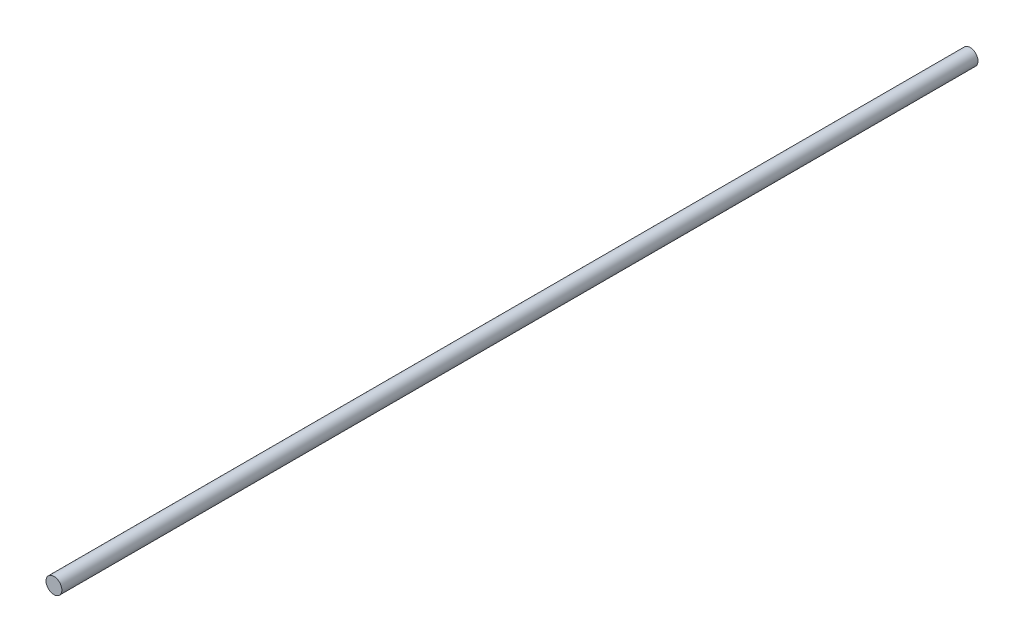
ISO-10303-21;
HEADER;
FILE_DESCRIPTION(('STEP AP214'),'2;1');
FILE_NAME('part.step','',(''),(''),'','','');
FILE_SCHEMA(('AUTOMOTIVE_DESIGN { 1 0 10303 214 1 1 1 1 }'));
ENDSEC;
DATA;
#1=APPLICATION_CONTEXT('core data for automotive mechanical design processes');
#2=APPLICATION_PROTOCOL_DEFINITION('international standard','automotive_design',2000,#1);
#3=PRODUCT_CONTEXT('',#1,'mechanical');
#4=PRODUCT('Part','Part','',(#3));
#5=PRODUCT_RELATED_PRODUCT_CATEGORY('part','',(#4));
#6=PRODUCT_DEFINITION_FORMATION('','',#4);
#7=PRODUCT_DEFINITION_CONTEXT('part definition',#1,'design');
#8=PRODUCT_DEFINITION('design','',#6,#7);
#9=PRODUCT_DEFINITION_SHAPE('','',#8);
#10=(LENGTH_UNIT() NAMED_UNIT(*) SI_UNIT(.MILLI.,.METRE.));
#11=(NAMED_UNIT(*) PLANE_ANGLE_UNIT() SI_UNIT($,.RADIAN.));
#12=(NAMED_UNIT(*) SI_UNIT($,.STERADIAN.) SOLID_ANGLE_UNIT());
#13=UNCERTAINTY_MEASURE_WITH_UNIT(LENGTH_MEASURE(1.E-05),#10,'distance_accuracy_value','');
#14=(GEOMETRIC_REPRESENTATION_CONTEXT(3) GLOBAL_UNCERTAINTY_ASSIGNED_CONTEXT((#13)) GLOBAL_UNIT_ASSIGNED_CONTEXT((#10,
#11,#12)) REPRESENTATION_CONTEXT('',''));
#15=CARTESIAN_POINT('',(0.,0.,0.));
#16=DIRECTION('',(0.,0.,1.));
#17=DIRECTION('',(1.,0.,0.));
#18=AXIS2_PLACEMENT_3D('',#15,#16,#17);
#19=CARTESIAN_POINT('',(0.,0.,231.25));
#20=DIRECTION('',(0.,0.,-1.));
#21=DIRECTION('',(-1.,0.,0.));
#22=AXIS2_PLACEMENT_3D('',#19,#20,#21);
#23=CYLINDRICAL_SURFACE('',#22,4.);
#24=CARTESIAN_POINT('',(0.,0.,231.25));
#25=DIRECTION('',(0.,0.,1.));
#26=DIRECTION('',(1.,0.,0.));
#27=AXIS2_PLACEMENT_3D('',#24,#25,#26);
#28=CIRCLE('',#27,4.);
#29=CARTESIAN_POINT('',(-4.,0.,231.25));
#30=VERTEX_POINT('',#29);
#31=EDGE_CURVE('E10',#30,#30,#28,.T.);
#32=CARTESIAN_POINT('',(0.,0.,-231.25));
#33=DIRECTION('',(0.,0.,1.));
#34=DIRECTION('',(1.,0.,0.));
#35=AXIS2_PLACEMENT_3D('',#32,#33,#34);
#36=CIRCLE('',#35,4.);
#37=CARTESIAN_POINT('',(-4.,0.,-231.25));
#38=VERTEX_POINT('',#37);
#39=EDGE_CURVE('E37',#38,#38,#36,.T.);
#40=CARTESIAN_POINT('',(-4.,0.,231.25));
#41=CARTESIAN_POINT('',(-4.,0.,226.432291666667));
#42=CARTESIAN_POINT('',(-4.,0.,221.614583333333));
#43=CARTESIAN_POINT('',(-4.,0.,211.979166666667));
#44=CARTESIAN_POINT('',(-4.,0.,207.161458333333));
#45=CARTESIAN_POINT('',(-4.,0.,197.526041666667));
#46=CARTESIAN_POINT('',(-4.,0.,192.708333333333));
#47=CARTESIAN_POINT('',(-4.,0.,183.072916666667));
#48=CARTESIAN_POINT('',(-4.,0.,178.255208333333));
#49=CARTESIAN_POINT('',(-4.,0.,168.619791666667));
#50=CARTESIAN_POINT('',(-4.,0.,163.802083333333));
#51=CARTESIAN_POINT('',(-4.,0.,154.166666666667));
#52=CARTESIAN_POINT('',(-4.,0.,149.348958333333));
#53=CARTESIAN_POINT('',(-4.,0.,139.713541666667));
#54=CARTESIAN_POINT('',(-4.,0.,134.895833333333));
#55=CARTESIAN_POINT('',(-4.,0.,125.260416666667));
#56=CARTESIAN_POINT('',(-4.,0.,120.442708333333));
#57=CARTESIAN_POINT('',(-4.,0.,110.807291666667));
#58=CARTESIAN_POINT('',(-4.,0.,105.989583333333));
#59=CARTESIAN_POINT('',(-4.,0.,96.3541666666667));
#60=CARTESIAN_POINT('',(-4.,0.,91.5364583333333));
#61=CARTESIAN_POINT('',(-4.,0.,81.9010416666667));
#62=CARTESIAN_POINT('',(-4.,0.,77.0833333333333));
#63=CARTESIAN_POINT('',(-4.,0.,67.4479166666667));
#64=CARTESIAN_POINT('',(-4.,0.,62.6302083333333));
#65=CARTESIAN_POINT('',(-4.,0.,52.9947916666667));
#66=CARTESIAN_POINT('',(-4.,0.,48.1770833333333));
#67=CARTESIAN_POINT('',(-4.,0.,38.5416666666667));
#68=CARTESIAN_POINT('',(-4.,0.,33.7239583333333));
#69=CARTESIAN_POINT('',(-4.,0.,24.0885416666667));
#70=CARTESIAN_POINT('',(-4.,0.,19.2708333333333));
#71=CARTESIAN_POINT('',(-4.,0.,9.63541666666665));
#72=CARTESIAN_POINT('',(-4.,0.,4.81770833333331));
#73=CARTESIAN_POINT('',(-4.,0.,-4.81770833333337));
#74=CARTESIAN_POINT('',(-4.,0.,-9.6354166666667));
#75=CARTESIAN_POINT('',(-4.,0.,-19.2708333333334));
#76=CARTESIAN_POINT('',(-4.,0.,-24.0885416666667));
#77=CARTESIAN_POINT('',(-4.,0.,-33.7239583333334));
#78=CARTESIAN_POINT('',(-4.,0.,-38.5416666666667));
#79=CARTESIAN_POINT('',(-4.,0.,-48.1770833333334));
#80=CARTESIAN_POINT('',(-4.,0.,-52.9947916666667));
#81=CARTESIAN_POINT('',(-4.,0.,-62.6302083333334));
#82=CARTESIAN_POINT('',(-4.,0.,-67.4479166666667));
#83=CARTESIAN_POINT('',(-4.,0.,-77.0833333333333));
#84=CARTESIAN_POINT('',(-4.,0.,-81.9010416666667));
#85=CARTESIAN_POINT('',(-4.,0.,-91.5364583333333));
#86=CARTESIAN_POINT('',(-4.,0.,-96.3541666666667));
#87=CARTESIAN_POINT('',(-4.,0.,-105.989583333333));
#88=CARTESIAN_POINT('',(-4.,0.,-110.807291666667));
#89=CARTESIAN_POINT('',(-4.,0.,-120.442708333333));
#90=CARTESIAN_POINT('',(-4.,0.,-125.260416666667));
#91=CARTESIAN_POINT('',(-4.,0.,-134.895833333333));
#92=CARTESIAN_POINT('',(-4.,0.,-139.713541666667));
#93=CARTESIAN_POINT('',(-4.,0.,-149.348958333333));
#94=CARTESIAN_POINT('',(-4.,0.,-154.166666666667));
#95=CARTESIAN_POINT('',(-4.,0.,-163.802083333333));
#96=CARTESIAN_POINT('',(-4.,0.,-168.619791666667));
#97=CARTESIAN_POINT('',(-4.,0.,-178.255208333333));
#98=CARTESIAN_POINT('',(-4.,0.,-183.072916666667));
#99=CARTESIAN_POINT('',(-4.,0.,-192.708333333333));
#100=CARTESIAN_POINT('',(-4.,0.,-197.526041666667));
#101=CARTESIAN_POINT('',(-4.,0.,-207.161458333333));
#102=CARTESIAN_POINT('',(-4.,0.,-211.979166666667));
#103=CARTESIAN_POINT('',(-4.,0.,-221.614583333333));
#104=CARTESIAN_POINT('',(-4.,0.,-226.432291666667));
#105=CARTESIAN_POINT('',(-4.,0.,-231.25));
#106=B_SPLINE_CURVE_WITH_KNOTS('',3,(#40,#41,#42,#43,#44,#45,#46,#47,#48,#49,#50,#51,#52,#53,
#54,#55,#56,#57,#58,#59,#60,#61,#62,#63,#64,#65,#66,#67,#68,#69,#70,#71,#72,#73,#74,#75,#76,#77,
#78,#79,#80,#81,#82,#83,#84,#85,#86,#87,#88,#89,#90,#91,#92,#93,#94,#95,#96,#97,#98,#99,#100,
#101,#102,#103,#104,#105),.UNSPECIFIED.,.F.,.F.,(4,2,2,2,2,2,2,2,2,2,2,2,2,2,2,2,2,2,2,2,2,2,2,
2,2,2,2,2,2,2,2,2,4),(0.,14.453125,28.90625,43.359375,57.8125,72.265625,86.71875,101.171875,
115.625,130.078125,144.53125,158.984375,173.4375,187.890625,202.34375,216.796875,231.25,
245.703125,260.15625,274.609375,289.0625,303.515625,317.96875,332.421875,346.875,361.328125,
375.78125,390.234375,404.6875,419.140625,433.59375,448.046875,462.5),.UNSPECIFIED.);
#107=EDGE_CURVE('BSEAM34',#30,#38,#106,.T.);
#108=ORIENTED_EDGE('',*,*,#31,.F.);
#109=ORIENTED_EDGE('',*,*,#39,.T.);
#110=ORIENTED_EDGE('',*,*,#107,.T.);
#111=ORIENTED_EDGE('',*,*,#107,.F.);
#112=EDGE_LOOP('',(#108,#110,#109,#111));
#113=FACE_BOUND('',#112,.T.);
#114=ADVANCED_FACE('F34',(#113),#23,.T.);
#115=CARTESIAN_POINT('',(0.,0.,231.25));
#116=DIRECTION('',(0.,0.,1.));
#117=DIRECTION('',(1.,0.,0.));
#118=AXIS2_PLACEMENT_3D('',#115,#116,#117);
#119=PLANE('',#118);
#120=ORIENTED_EDGE('',*,*,#31,.T.);
#121=EDGE_LOOP('',(#120));
#122=FACE_BOUND('',#121,.T.);
#123=ADVANCED_FACE('F49',(#122),#119,.T.);
#124=CARTESIAN_POINT('',(0.,0.,-231.25));
#125=DIRECTION('',(0.,0.,1.));
#126=DIRECTION('',(1.,0.,0.));
#127=AXIS2_PLACEMENT_3D('',#124,#125,#126);
#128=PLANE('',#127);
#129=ORIENTED_EDGE('',*,*,#39,.F.);
#130=EDGE_LOOP('',(#129));
#131=FACE_BOUND('',#130,.T.);
#132=ADVANCED_FACE('F47',(#131),#128,.F.);
#133=CLOSED_SHELL('',(#114,#123,#132));
#134=MANIFOLD_SOLID_BREP('B2',#133);
#135=ADVANCED_BREP_SHAPE_REPRESENTATION('',(#18,#134),#14);
#136=SHAPE_DEFINITION_REPRESENTATION(#9,#135);
ENDSEC;
END-ISO-10303-21;
